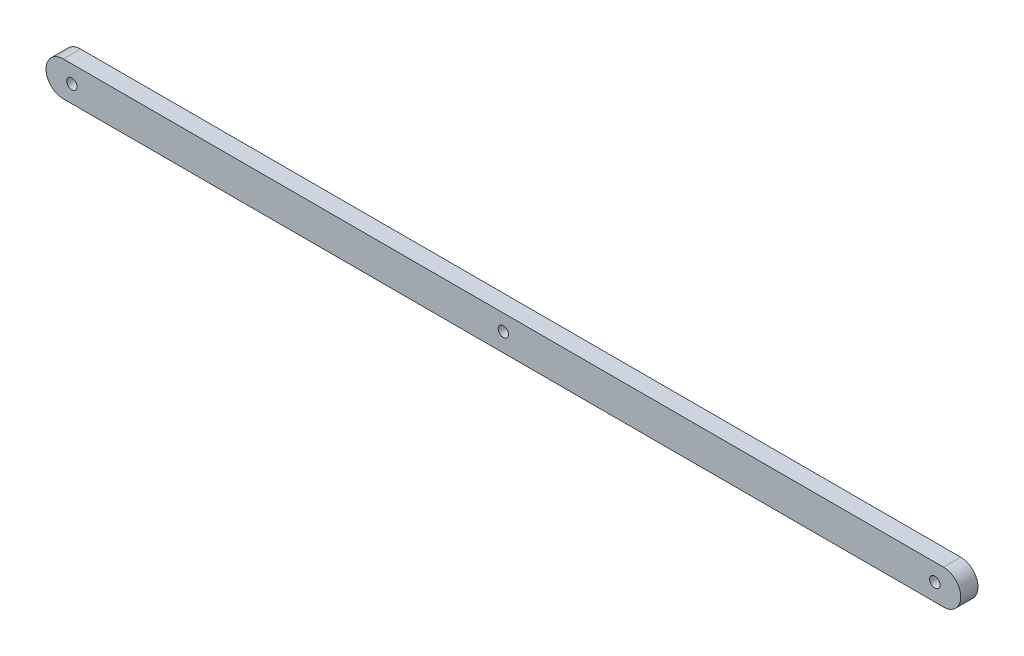
ISO-10303-21;
HEADER;
FILE_DESCRIPTION(('STEP AP214'),'2;1');
FILE_NAME('part.step','',(''),(''),'','','');
FILE_SCHEMA(('AUTOMOTIVE_DESIGN { 1 0 10303 214 1 1 1 1 }'));
ENDSEC;
DATA;
#1=APPLICATION_CONTEXT('core data for automotive mechanical design processes');
#2=APPLICATION_PROTOCOL_DEFINITION('international standard','automotive_design',2000,#1);
#3=PRODUCT_CONTEXT('',#1,'mechanical');
#4=PRODUCT('Part','Part','',(#3));
#5=PRODUCT_RELATED_PRODUCT_CATEGORY('part','',(#4));
#6=PRODUCT_DEFINITION_FORMATION('','',#4);
#7=PRODUCT_DEFINITION_CONTEXT('part definition',#1,'design');
#8=PRODUCT_DEFINITION('design','',#6,#7);
#9=PRODUCT_DEFINITION_SHAPE('','',#8);
#10=(LENGTH_UNIT() NAMED_UNIT(*) SI_UNIT(.MILLI.,.METRE.));
#11=(NAMED_UNIT(*) PLANE_ANGLE_UNIT() SI_UNIT($,.RADIAN.));
#12=(NAMED_UNIT(*) SI_UNIT($,.STERADIAN.) SOLID_ANGLE_UNIT());
#13=UNCERTAINTY_MEASURE_WITH_UNIT(LENGTH_MEASURE(1.E-05),#10,'distance_accuracy_value','');
#14=(GEOMETRIC_REPRESENTATION_CONTEXT(3) GLOBAL_UNCERTAINTY_ASSIGNED_CONTEXT((#13)) GLOBAL_UNIT_ASSIGNED_CONTEXT((#10,
#11,#12)) REPRESENTATION_CONTEXT('',''));
#15=CARTESIAN_POINT('',(0.,0.,0.));
#16=DIRECTION('',(0.,0.,1.));
#17=DIRECTION('',(1.,0.,0.));
#18=AXIS2_PLACEMENT_3D('',#15,#16,#17);
#19=CARTESIAN_POINT('',(-122.628083491461,-18.2258064516129,10.));
#20=DIRECTION('',(0.,0.,-1.));
#21=DIRECTION('',(-1.,0.,0.));
#22=AXIS2_PLACEMENT_3D('',#19,#20,#21);
#23=PLANE('',#22);
#24=CARTESIAN_POINT('',(132.370892358984,-17.5102131811431,10.));
#25=DIRECTION('',(0.,0.,1.));
#26=DIRECTION('',(1.,0.,0.));
#27=AXIS2_PLACEMENT_3D('',#24,#25,#26);
#28=CIRCLE('',#27,2.99999999999999);
#29=CARTESIAN_POINT('',(135.370892358984,-17.5102131811431,10.));
#30=VERTEX_POINT('',#29);
#31=EDGE_CURVE('E124',#30,#30,#28,.T.);
#32=ORIENTED_EDGE('',*,*,#31,.F.);
#33=EDGE_LOOP('',(#32));
#34=FACE_BOUND('',#33,.T.);
#35=CARTESIAN_POINT('',(-122.628083491461,-18.2258064516129,10.));
#36=DIRECTION('',(0.,0.,1.));
#37=DIRECTION('',(-1.,0.,0.));
#38=AXIS2_PLACEMENT_3D('',#35,#36,#37);
#39=CIRCLE('',#38,10.);
#40=CARTESIAN_POINT('',(-122.628083491461,-8.22580645161288,10.));
#41=VERTEX_POINT('',#40);
#42=CARTESIAN_POINT('',(-122.628083491461,-28.2258064516129,10.));
#43=VERTEX_POINT('',#42);
#44=EDGE_CURVE('E85',#41,#43,#39,.T.);
#45=ORIENTED_EDGE('',*,*,#44,.T.);
#46=DIRECTION('',(1.,0.,0.));
#47=VECTOR('',#46,1.);
#48=CARTESIAN_POINT('',(-122.628083491461,-28.2258064516129,10.));
#49=LINE('',#48,#47);
#50=CARTESIAN_POINT('',(387.371916508539,-28.2258064516129,10.));
#51=VERTEX_POINT('',#50);
#52=EDGE_CURVE('E80',#43,#51,#49,.T.);
#53=ORIENTED_EDGE('',*,*,#52,.T.);
#54=CARTESIAN_POINT('',(387.371916508539,-18.2258064516129,10.));
#55=DIRECTION('',(0.,0.,1.));
#56=DIRECTION('',(1.,0.,0.));
#57=AXIS2_PLACEMENT_3D('',#54,#55,#56);
#58=CIRCLE('',#57,10.);
#59=CARTESIAN_POINT('',(387.371916508539,-8.22580645161288,10.));
#60=VERTEX_POINT('',#59);
#61=EDGE_CURVE('E83',#51,#60,#58,.T.);
#62=ORIENTED_EDGE('',*,*,#61,.T.);
#63=DIRECTION('',(-1.,0.,0.));
#64=VECTOR('',#63,1.);
#65=CARTESIAN_POINT('',(-122.628083491461,-8.22580645161288,10.));
#66=LINE('',#65,#64);
#67=EDGE_CURVE('E50',#60,#41,#66,.T.);
#68=ORIENTED_EDGE('',*,*,#67,.T.);
#69=EDGE_LOOP('',(#45,#53,#62,#68));
#70=FACE_BOUND('',#69,.T.);
#71=CARTESIAN_POINT('',(-117.628083491461,-18.2258064516129,10.));
#72=DIRECTION('',(0.,0.,1.));
#73=DIRECTION('',(1.,0.,0.));
#74=AXIS2_PLACEMENT_3D('',#71,#72,#73);
#75=CIRCLE('',#74,3.00000000000001);
#76=CARTESIAN_POINT('',(-114.628083491461,-18.2258064516129,10.));
#77=VERTEX_POINT('',#76);
#78=EDGE_CURVE('E100',#77,#77,#75,.T.);
#79=ORIENTED_EDGE('',*,*,#78,.F.);
#80=EDGE_LOOP('',(#79));
#81=FACE_BOUND('',#80,.T.);
#82=CARTESIAN_POINT('',(382.371916508539,-18.2258064516129,10.));
#83=DIRECTION('',(0.,0.,1.));
#84=DIRECTION('',(1.,0.,0.));
#85=AXIS2_PLACEMENT_3D('',#82,#83,#84);
#86=CIRCLE('',#85,2.99999999999999);
#87=CARTESIAN_POINT('',(385.371916508539,-18.2258064516129,10.));
#88=VERTEX_POINT('',#87);
#89=EDGE_CURVE('E115',#88,#88,#86,.T.);
#90=ORIENTED_EDGE('',*,*,#89,.F.);
#91=EDGE_LOOP('',(#90));
#92=FACE_BOUND('',#91,.T.);
#93=ADVANCED_FACE('F33',(#34,#70,#81,#92),#23,.F.);
#94=CARTESIAN_POINT('',(-122.628083491461,-18.2258064516129,0.));
#95=DIRECTION('',(0.,0.,-1.));
#96=DIRECTION('',(-1.,0.,0.));
#97=AXIS2_PLACEMENT_3D('',#94,#95,#96);
#98=PLANE('',#97);
#99=CARTESIAN_POINT('',(132.370892358984,-17.5102131811431,0.));
#100=DIRECTION('',(0.,0.,1.));
#101=DIRECTION('',(1.,0.,0.));
#102=AXIS2_PLACEMENT_3D('',#99,#100,#101);
#103=CIRCLE('',#102,2.99999999999999);
#104=CARTESIAN_POINT('',(135.370892358984,-17.5102131811431,0.));
#105=VERTEX_POINT('',#104);
#106=EDGE_CURVE('E121',#105,#105,#103,.T.);
#107=ORIENTED_EDGE('',*,*,#106,.T.);
#108=EDGE_LOOP('',(#107));
#109=FACE_BOUND('',#108,.T.);
#110=CARTESIAN_POINT('',(-117.628083491461,-18.2258064516129,0.));
#111=DIRECTION('',(0.,0.,1.));
#112=DIRECTION('',(1.,0.,0.));
#113=AXIS2_PLACEMENT_3D('',#110,#111,#112);
#114=CIRCLE('',#113,3.00000000000001);
#115=CARTESIAN_POINT('',(-114.628083491461,-18.2258064516129,0.));
#116=VERTEX_POINT('',#115);
#117=EDGE_CURVE('E112',#116,#116,#114,.T.);
#118=ORIENTED_EDGE('',*,*,#117,.T.);
#119=EDGE_LOOP('',(#118));
#120=FACE_BOUND('',#119,.T.);
#121=CARTESIAN_POINT('',(-122.628083491461,-18.2258064516129,0.));
#122=DIRECTION('',(0.,0.,1.));
#123=DIRECTION('',(-1.,0.,0.));
#124=AXIS2_PLACEMENT_3D('',#121,#122,#123);
#125=CIRCLE('',#124,10.);
#126=CARTESIAN_POINT('',(-122.628083491461,-8.22580645161288,0.));
#127=VERTEX_POINT('',#126);
#128=CARTESIAN_POINT('',(-122.628083491461,-28.2258064516129,0.));
#129=VERTEX_POINT('',#128);
#130=EDGE_CURVE('E97',#127,#129,#125,.T.);
#131=ORIENTED_EDGE('',*,*,#130,.F.);
#132=DIRECTION('',(-1.,0.,0.));
#133=VECTOR('',#132,1.);
#134=CARTESIAN_POINT('',(-122.628083491461,-8.22580645161288,0.));
#135=LINE('',#134,#133);
#136=CARTESIAN_POINT('',(387.371916508539,-8.22580645161288,0.));
#137=VERTEX_POINT('',#136);
#138=EDGE_CURVE('E73',#137,#127,#135,.T.);
#139=ORIENTED_EDGE('',*,*,#138,.F.);
#140=CARTESIAN_POINT('',(387.371916508539,-18.2258064516129,0.));
#141=DIRECTION('',(0.,0.,1.));
#142=DIRECTION('',(1.,0.,0.));
#143=AXIS2_PLACEMENT_3D('',#140,#141,#142);
#144=CIRCLE('',#143,10.);
#145=CARTESIAN_POINT('',(387.371916508539,-28.2258064516129,0.));
#146=VERTEX_POINT('',#145);
#147=EDGE_CURVE('E67',#146,#137,#144,.T.);
#148=ORIENTED_EDGE('',*,*,#147,.F.);
#149=DIRECTION('',(1.,0.,0.));
#150=VECTOR('',#149,1.);
#151=CARTESIAN_POINT('',(-122.628083491461,-28.2258064516129,0.));
#152=LINE('',#151,#150);
#153=EDGE_CURVE('E89',#129,#146,#152,.T.);
#154=ORIENTED_EDGE('',*,*,#153,.F.);
#155=EDGE_LOOP('',(#131,#139,#148,#154));
#156=FACE_BOUND('',#155,.T.);
#157=CARTESIAN_POINT('',(382.371916508539,-18.2258064516129,0.));
#158=DIRECTION('',(0.,0.,1.));
#159=DIRECTION('',(1.,0.,0.));
#160=AXIS2_PLACEMENT_3D('',#157,#158,#159);
#161=CIRCLE('',#160,2.99999999999999);
#162=CARTESIAN_POINT('',(385.371916508539,-18.2258064516129,0.));
#163=VERTEX_POINT('',#162);
#164=EDGE_CURVE('E118',#163,#163,#161,.T.);
#165=ORIENTED_EDGE('',*,*,#164,.T.);
#166=EDGE_LOOP('',(#165));
#167=FACE_BOUND('',#166,.T.);
#168=ADVANCED_FACE('F108',(#109,#120,#156,#167),#98,.T.);
#169=CARTESIAN_POINT('',(-122.628083491461,-18.2258064516129,10.));
#170=DIRECTION('',(0.,0.,-1.));
#171=DIRECTION('',(-1.,0.,0.));
#172=AXIS2_PLACEMENT_3D('',#169,#170,#171);
#173=CYLINDRICAL_SURFACE('',#172,10.);
#174=ORIENTED_EDGE('',*,*,#130,.T.);
#175=DIRECTION('',(0.,0.,-1.));
#176=VECTOR('',#175,1.);
#177=CARTESIAN_POINT('',(-122.628083491461,-28.2258064516129,10.));
#178=LINE('',#177,#176);
#179=EDGE_CURVE('E11',#43,#129,#178,.T.);
#180=ORIENTED_EDGE('',*,*,#179,.F.);
#181=ORIENTED_EDGE('',*,*,#44,.F.);
#182=DIRECTION('',(0.,0.,-1.));
#183=VECTOR('',#182,1.);
#184=CARTESIAN_POINT('',(-122.628083491461,-8.22580645161288,10.));
#185=LINE('',#184,#183);
#186=EDGE_CURVE('E93',#41,#127,#185,.T.);
#187=ORIENTED_EDGE('',*,*,#186,.T.);
#188=EDGE_LOOP('',(#174,#180,#181,#187));
#189=FACE_BOUND('',#188,.T.);
#190=ADVANCED_FACE('F35',(#189),#173,.T.);
#191=CARTESIAN_POINT('',(-122.628083491461,-28.2258064516129,10.));
#192=DIRECTION('',(0.,1.,0.));
#193=DIRECTION('',(0.,0.,1.));
#194=AXIS2_PLACEMENT_3D('',#191,#192,#193);
#195=PLANE('',#194);
#196=ORIENTED_EDGE('',*,*,#153,.T.);
#197=DIRECTION('',(0.,0.,-1.));
#198=VECTOR('',#197,1.);
#199=CARTESIAN_POINT('',(387.371916508539,-28.2258064516129,10.));
#200=LINE('',#199,#198);
#201=EDGE_CURVE('E42',#51,#146,#200,.T.);
#202=ORIENTED_EDGE('',*,*,#201,.F.);
#203=ORIENTED_EDGE('',*,*,#52,.F.);
#204=ORIENTED_EDGE('',*,*,#179,.T.);
#205=EDGE_LOOP('',(#196,#202,#203,#204));
#206=FACE_BOUND('',#205,.T.);
#207=ADVANCED_FACE('F88',(#206),#195,.F.);
#208=CARTESIAN_POINT('',(387.371916508539,-18.2258064516129,10.));
#209=DIRECTION('',(0.,0.,-1.));
#210=DIRECTION('',(-1.,0.,0.));
#211=AXIS2_PLACEMENT_3D('',#208,#209,#210);
#212=CYLINDRICAL_SURFACE('',#211,10.);
#213=ORIENTED_EDGE('',*,*,#147,.T.);
#214=DIRECTION('',(0.,0.,-1.));
#215=VECTOR('',#214,1.);
#216=CARTESIAN_POINT('',(387.371916508539,-8.22580645161288,10.));
#217=LINE('',#216,#215);
#218=EDGE_CURVE('E90',#60,#137,#217,.T.);
#219=ORIENTED_EDGE('',*,*,#218,.F.);
#220=ORIENTED_EDGE('',*,*,#61,.F.);
#221=ORIENTED_EDGE('',*,*,#201,.T.);
#222=EDGE_LOOP('',(#213,#219,#220,#221));
#223=FACE_BOUND('',#222,.T.);
#224=ADVANCED_FACE('F91',(#223),#212,.T.);
#225=CARTESIAN_POINT('',(-122.628083491461,-8.22580645161288,10.));
#226=DIRECTION('',(0.,-1.,0.));
#227=DIRECTION('',(1.,0.,0.));
#228=AXIS2_PLACEMENT_3D('',#225,#226,#227);
#229=PLANE('',#228);
#230=ORIENTED_EDGE('',*,*,#138,.T.);
#231=ORIENTED_EDGE('',*,*,#186,.F.);
#232=ORIENTED_EDGE('',*,*,#67,.F.);
#233=ORIENTED_EDGE('',*,*,#218,.T.);
#234=EDGE_LOOP('',(#230,#231,#232,#233));
#235=FACE_BOUND('',#234,.T.);
#236=ADVANCED_FACE('F105',(#235),#229,.F.);
#237=CARTESIAN_POINT('',(-117.628083491461,-18.2258064516129,10.));
#238=DIRECTION('',(0.,0.,-1.));
#239=DIRECTION('',(-1.,0.,0.));
#240=AXIS2_PLACEMENT_3D('',#237,#238,#239);
#241=CYLINDRICAL_SURFACE('',#240,3.00000000000001);
#242=ORIENTED_EDGE('',*,*,#78,.T.);
#243=EDGE_LOOP('',(#242));
#244=FACE_BOUND('',#243,.T.);
#245=ORIENTED_EDGE('',*,*,#117,.F.);
#246=EDGE_LOOP('',(#245));
#247=FACE_BOUND('',#246,.T.);
#248=ADVANCED_FACE('F147',(#244,#247),#241,.F.);
#249=CARTESIAN_POINT('',(382.371916508539,-18.2258064516129,10.));
#250=DIRECTION('',(0.,0.,-1.));
#251=DIRECTION('',(-1.,0.,0.));
#252=AXIS2_PLACEMENT_3D('',#249,#250,#251);
#253=CYLINDRICAL_SURFACE('',#252,2.99999999999999);
#254=ORIENTED_EDGE('',*,*,#89,.T.);
#255=EDGE_LOOP('',(#254));
#256=FACE_BOUND('',#255,.T.);
#257=ORIENTED_EDGE('',*,*,#164,.F.);
#258=EDGE_LOOP('',(#257));
#259=FACE_BOUND('',#258,.T.);
#260=ADVANCED_FACE('F135',(#256,#259),#253,.F.);
#261=CARTESIAN_POINT('',(132.370892358984,-17.5102131811431,0.));
#262=DIRECTION('',(0.,0.,1.));
#263=DIRECTION('',(1.,0.,0.));
#264=AXIS2_PLACEMENT_3D('',#261,#262,#263);
#265=CYLINDRICAL_SURFACE('',#264,2.99999999999999);
#266=ORIENTED_EDGE('',*,*,#106,.F.);
#267=EDGE_LOOP('',(#266));
#268=FACE_BOUND('',#267,.T.);
#269=ORIENTED_EDGE('',*,*,#31,.T.);
#270=EDGE_LOOP('',(#269));
#271=FACE_BOUND('',#270,.T.);
#272=ADVANCED_FACE('F132',(#268,#271),#265,.F.);
#273=CLOSED_SHELL('',(#93,#168,#190,#207,#224,#236,#248,#260,#272));
#274=MANIFOLD_SOLID_BREP('B2',#273);
#275=ADVANCED_BREP_SHAPE_REPRESENTATION('',(#18,#274),#14);
#276=SHAPE_DEFINITION_REPRESENTATION(#9,#275);
ENDSEC;
END-ISO-10303-21;
